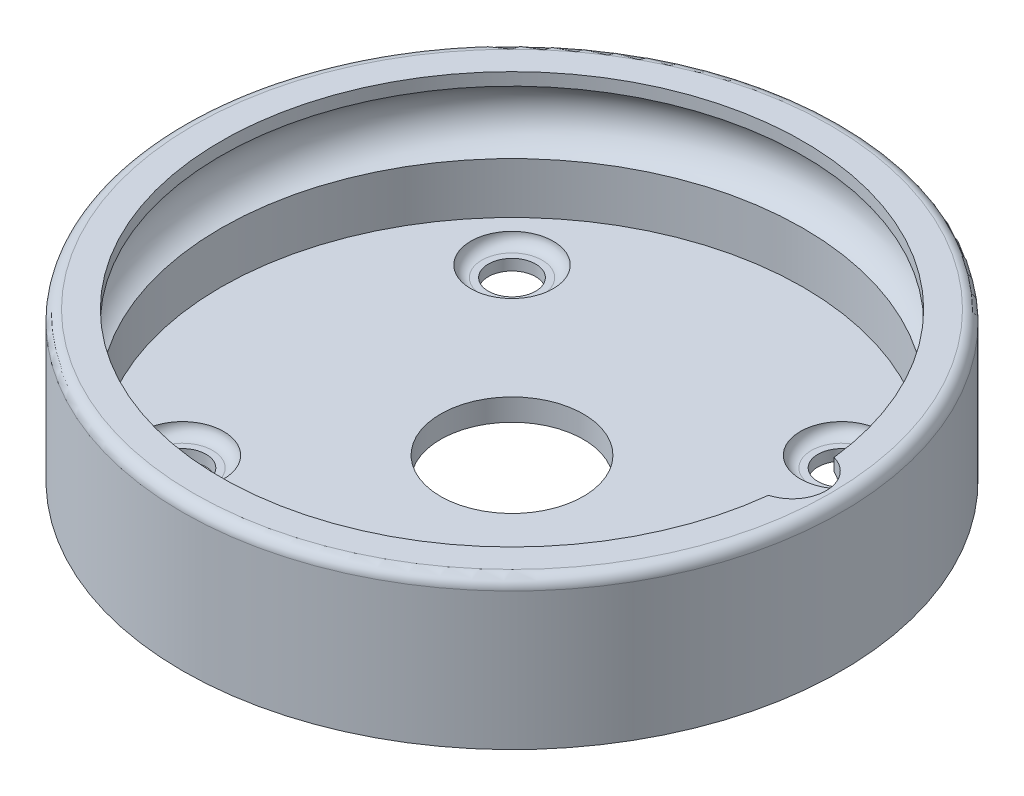
ISO-10303-21;
HEADER;
FILE_DESCRIPTION(('STEP AP214'),'2;1');
FILE_NAME('part.step','',(''),(''),'','','');
FILE_SCHEMA(('AUTOMOTIVE_DESIGN { 1 0 10303 214 1 1 1 1 }'));
ENDSEC;
DATA;
#1=APPLICATION_CONTEXT('core data for automotive mechanical design processes');
#2=APPLICATION_PROTOCOL_DEFINITION('international standard','automotive_design',2000,#1);
#3=PRODUCT_CONTEXT('',#1,'mechanical');
#4=PRODUCT('Part','Part','',(#3));
#5=PRODUCT_RELATED_PRODUCT_CATEGORY('part','',(#4));
#6=PRODUCT_DEFINITION_FORMATION('','',#4);
#7=PRODUCT_DEFINITION_CONTEXT('part definition',#1,'design');
#8=PRODUCT_DEFINITION('design','',#6,#7);
#9=PRODUCT_DEFINITION_SHAPE('','',#8);
#10=(LENGTH_UNIT() NAMED_UNIT(*) SI_UNIT(.MILLI.,.METRE.));
#11=(NAMED_UNIT(*) PLANE_ANGLE_UNIT() SI_UNIT($,.RADIAN.));
#12=(NAMED_UNIT(*) SI_UNIT($,.STERADIAN.) SOLID_ANGLE_UNIT());
#13=UNCERTAINTY_MEASURE_WITH_UNIT(LENGTH_MEASURE(1.E-05),#10,'distance_accuracy_value','');
#14=(GEOMETRIC_REPRESENTATION_CONTEXT(3) GLOBAL_UNCERTAINTY_ASSIGNED_CONTEXT((#13)) GLOBAL_UNIT_ASSIGNED_CONTEXT((#10,
#11,#12)) REPRESENTATION_CONTEXT('',''));
#15=CARTESIAN_POINT('',(0.,0.,0.));
#16=DIRECTION('',(0.,0.,1.));
#17=DIRECTION('',(1.,0.,0.));
#18=AXIS2_PLACEMENT_3D('',#15,#16,#17);
#19=CARTESIAN_POINT('',(14.9999999999998,0.,-15.0000000000002));
#20=DIRECTION('',(0.,1.,0.));
#21=DIRECTION('',(0.,0.,1.));
#22=AXIS2_PLACEMENT_3D('',#19,#20,#21);
#23=CYLINDRICAL_SURFACE('',#22,2.15);
#24=CARTESIAN_POINT('',(14.9999999999998,0.,-15.0000000000002));
#25=DIRECTION('',(0.,1.,0.));
#26=DIRECTION('',(-1.,0.,0.));
#27=AXIS2_PLACEMENT_3D('',#24,#25,#26);
#28=CIRCLE('',#27,2.15);
#29=CARTESIAN_POINT('',(12.8499999999998,0.,-15.0000000000001));
#30=VERTEX_POINT('',#29);
#31=EDGE_CURVE('E179',#30,#30,#28,.T.);
#32=ORIENTED_EDGE('',*,*,#31,.F.);
#33=EDGE_LOOP('',(#32));
#34=FACE_BOUND('',#33,.T.);
#35=CARTESIAN_POINT('',(14.9999999999998,1.,-15.0000000000002));
#36=DIRECTION('',(0.,1.,0.));
#37=DIRECTION('',(0.,0.,1.));
#38=AXIS2_PLACEMENT_3D('',#35,#36,#37);
#39=CIRCLE('',#38,2.15);
#40=CARTESIAN_POINT('',(14.9999999999998,1.,-12.8500000000002));
#41=VERTEX_POINT('',#40);
#42=EDGE_CURVE('E176',#41,#41,#39,.F.);
#43=ORIENTED_EDGE('',*,*,#42,.F.);
#44=EDGE_LOOP('',(#43));
#45=FACE_BOUND('',#44,.T.);
#46=ADVANCED_FACE('F37',(#34,#45),#23,.F.);
#47=CARTESIAN_POINT('',(15.,0.,15.));
#48=DIRECTION('',(0.,1.,0.));
#49=DIRECTION('',(0.,0.,1.));
#50=AXIS2_PLACEMENT_3D('',#47,#48,#49);
#51=CYLINDRICAL_SURFACE('',#50,2.15);
#52=CARTESIAN_POINT('',(15.,0.,15.));
#53=DIRECTION('',(0.,1.,0.));
#54=DIRECTION('',(0.,0.,-1.));
#55=AXIS2_PLACEMENT_3D('',#52,#53,#54);
#56=CIRCLE('',#55,2.15);
#57=CARTESIAN_POINT('',(15.,0.,12.85));
#58=VERTEX_POINT('',#57);
#59=EDGE_CURVE('E272',#58,#58,#56,.T.);
#60=ORIENTED_EDGE('',*,*,#59,.F.);
#61=EDGE_LOOP('',(#60));
#62=FACE_BOUND('',#61,.T.);
#63=CARTESIAN_POINT('',(15.,1.,15.));
#64=DIRECTION('',(0.,1.,0.));
#65=DIRECTION('',(0.,0.,1.));
#66=AXIS2_PLACEMENT_3D('',#63,#64,#65);
#67=CIRCLE('',#66,2.15);
#68=CARTESIAN_POINT('',(15.,1.,17.15));
#69=VERTEX_POINT('',#68);
#70=EDGE_CURVE('E172',#69,#69,#67,.F.);
#71=ORIENTED_EDGE('',*,*,#70,.F.);
#72=EDGE_LOOP('',(#71));
#73=FACE_BOUND('',#72,.T.);
#74=ADVANCED_FACE('F123',(#62,#73),#51,.F.);
#75=CARTESIAN_POINT('',(-14.9999999999999,0.,15.0000000000001));
#76=DIRECTION('',(0.,1.,0.));
#77=DIRECTION('',(0.,0.,1.));
#78=AXIS2_PLACEMENT_3D('',#75,#76,#77);
#79=CYLINDRICAL_SURFACE('',#78,2.15);
#80=CARTESIAN_POINT('',(-14.9999999999999,0.,15.0000000000001));
#81=DIRECTION('',(0.,1.,0.));
#82=DIRECTION('',(1.,0.,0.));
#83=AXIS2_PLACEMENT_3D('',#80,#81,#82);
#84=CIRCLE('',#83,2.15);
#85=CARTESIAN_POINT('',(-12.8499999999999,0.,15.));
#86=VERTEX_POINT('',#85);
#87=EDGE_CURVE('E163',#86,#86,#84,.T.);
#88=ORIENTED_EDGE('',*,*,#87,.F.);
#89=EDGE_LOOP('',(#88));
#90=FACE_BOUND('',#89,.T.);
#91=CARTESIAN_POINT('',(-14.9999999999999,1.,15.0000000000001));
#92=DIRECTION('',(0.,1.,0.));
#93=DIRECTION('',(0.,0.,1.));
#94=AXIS2_PLACEMENT_3D('',#91,#92,#93);
#95=CIRCLE('',#94,2.15);
#96=CARTESIAN_POINT('',(-14.9999999999999,1.,17.1500000000001));
#97=VERTEX_POINT('',#96);
#98=EDGE_CURVE('E169',#97,#97,#95,.F.);
#99=ORIENTED_EDGE('',*,*,#98,.F.);
#100=EDGE_LOOP('',(#99));
#101=FACE_BOUND('',#100,.T.);
#102=ADVANCED_FACE('F129',(#90,#101),#79,.F.);
#103=CARTESIAN_POINT('',(-15.,0.,-15.));
#104=DIRECTION('',(0.,1.,0.));
#105=DIRECTION('',(0.,0.,1.));
#106=AXIS2_PLACEMENT_3D('',#103,#104,#105);
#107=CYLINDRICAL_SURFACE('',#106,2.15);
#108=CARTESIAN_POINT('',(-15.,0.,-15.));
#109=DIRECTION('',(0.,1.,0.));
#110=DIRECTION('',(0.,0.,1.));
#111=AXIS2_PLACEMENT_3D('',#108,#109,#110);
#112=CIRCLE('',#111,2.15);
#113=CARTESIAN_POINT('',(-15.,0.,-12.85));
#114=VERTEX_POINT('',#113);
#115=EDGE_CURVE('E155',#114,#114,#112,.T.);
#116=ORIENTED_EDGE('',*,*,#115,.F.);
#117=EDGE_LOOP('',(#116));
#118=FACE_BOUND('',#117,.T.);
#119=CARTESIAN_POINT('',(-15.,1.,-15.));
#120=DIRECTION('',(0.,1.,0.));
#121=DIRECTION('',(0.,0.,1.));
#122=AXIS2_PLACEMENT_3D('',#119,#120,#121);
#123=CIRCLE('',#122,2.15);
#124=CARTESIAN_POINT('',(-15.,1.,-12.85));
#125=VERTEX_POINT('',#124);
#126=EDGE_CURVE('E158',#125,#125,#123,.F.);
#127=ORIENTED_EDGE('',*,*,#126,.F.);
#128=EDGE_LOOP('',(#127));
#129=FACE_BOUND('',#128,.T.);
#130=ADVANCED_FACE('F140',(#118,#129),#107,.F.);
#131=CARTESIAN_POINT('',(0.,2.,0.));
#132=DIRECTION('',(0.,1.,0.));
#133=DIRECTION('',(0.,0.,1.));
#134=AXIS2_PLACEMENT_3D('',#131,#132,#133);
#135=PLANE('',#134);
#136=CARTESIAN_POINT('',(-14.9999999999999,2.,15.0000000000001));
#137=DIRECTION('',(0.,1.,0.));
#138=DIRECTION('',(1.,0.,0.));
#139=AXIS2_PLACEMENT_3D('',#136,#137,#138);
#140=CIRCLE('',#139,3.75);
#141=CARTESIAN_POINT('',(-11.2499999999999,2.,15.));
#142=VERTEX_POINT('',#141);
#143=EDGE_CURVE('E173',#142,#142,#140,.T.);
#144=ORIENTED_EDGE('',*,*,#143,.F.);
#145=EDGE_LOOP('',(#144));
#146=FACE_BOUND('',#145,.T.);
#147=CARTESIAN_POINT('',(15.,2.,15.));
#148=DIRECTION('',(0.,1.,0.));
#149=DIRECTION('',(0.,0.,-1.));
#150=AXIS2_PLACEMENT_3D('',#147,#148,#149);
#151=CIRCLE('',#150,3.75);
#152=CARTESIAN_POINT('',(15.,2.,11.25));
#153=VERTEX_POINT('',#152);
#154=EDGE_CURVE('E280',#153,#153,#151,.T.);
#155=ORIENTED_EDGE('',*,*,#154,.F.);
#156=EDGE_LOOP('',(#155));
#157=FACE_BOUND('',#156,.T.);
#158=CARTESIAN_POINT('',(14.9999999999998,2.,-15.0000000000002));
#159=DIRECTION('',(0.,1.,0.));
#160=DIRECTION('',(-1.,0.,0.));
#161=AXIS2_PLACEMENT_3D('',#158,#159,#160);
#162=CIRCLE('',#161,3.75);
#163=CARTESIAN_POINT('',(11.2499999999998,2.,-15.0000000000001));
#164=VERTEX_POINT('',#163);
#165=EDGE_CURVE('E277',#164,#164,#162,.T.);
#166=ORIENTED_EDGE('',*,*,#165,.F.);
#167=EDGE_LOOP('',(#166));
#168=FACE_BOUND('',#167,.T.);
#169=CARTESIAN_POINT('',(-15.,2.,-15.));
#170=DIRECTION('',(0.,1.,0.));
#171=DIRECTION('',(0.,0.,1.));
#172=AXIS2_PLACEMENT_3D('',#169,#170,#171);
#173=CIRCLE('',#172,3.75);
#174=CARTESIAN_POINT('',(-15.,2.,-11.25));
#175=VERTEX_POINT('',#174);
#176=EDGE_CURVE('E160',#175,#175,#173,.T.);
#177=ORIENTED_EDGE('',*,*,#176,.F.);
#178=EDGE_LOOP('',(#177));
#179=FACE_BOUND('',#178,.T.);
#180=CARTESIAN_POINT('',(0.,2.,0.));
#181=DIRECTION('',(0.,1.,0.));
#182=DIRECTION('',(0.,0.,1.));
#183=AXIS2_PLACEMENT_3D('',#180,#181,#182);
#184=CIRCLE('',#183,26.5);
#185=CARTESIAN_POINT('',(26.5,2.,0.));
#186=VERTEX_POINT('',#185);
#187=EDGE_CURVE('E238',#186,#186,#184,.T.);
#188=ORIENTED_EDGE('',*,*,#187,.T.);
#189=CARTESIAN_POINT('',(25.5,2.,0.));
#190=DIRECTION('',(0.,1.,0.));
#191=DIRECTION('',(0.,0.,1.));
#192=AXIS2_PLACEMENT_3D('',#189,#190,#191);
#193=CIRCLE('',#192,1.);
#194=EDGE_CURVE('E50',#186,#186,#193,.T.);
#195=ORIENTED_EDGE('',*,*,#194,.F.);
#196=EDGE_LOOP('',(#188,#195));
#197=FACE_BOUND('',#196,.T.);
#198=CARTESIAN_POINT('',(0.,2.,0.));
#199=DIRECTION('',(0.,1.,0.));
#200=DIRECTION('',(0.,0.,1.));
#201=AXIS2_PLACEMENT_3D('',#198,#199,#200);
#202=CIRCLE('',#201,6.5);
#203=CARTESIAN_POINT('',(0.,2.,6.5));
#204=VERTEX_POINT('',#203);
#205=EDGE_CURVE('E78',#204,#204,#202,.T.);
#206=ORIENTED_EDGE('',*,*,#205,.F.);
#207=EDGE_LOOP('',(#206));
#208=FACE_BOUND('',#207,.T.);
#209=ADVANCED_FACE('F142',(#146,#157,#168,#179,#197,#208),#135,.T.);
#210=CARTESIAN_POINT('',(0.,2.,0.));
#211=DIRECTION('',(0.,1.,0.));
#212=DIRECTION('',(0.,0.,1.));
#213=AXIS2_PLACEMENT_3D('',#210,#211,#212);
#214=CYLINDRICAL_SURFACE('',#213,6.5);
#215=CARTESIAN_POINT('',(0.,0.,0.));
#216=DIRECTION('',(0.,1.,0.));
#217=DIRECTION('',(0.,0.,1.));
#218=AXIS2_PLACEMENT_3D('',#215,#216,#217);
#219=CIRCLE('',#218,6.5);
#220=CARTESIAN_POINT('',(0.,0.,6.5));
#221=VERTEX_POINT('',#220);
#222=EDGE_CURVE('E250',#221,#221,#219,.T.);
#223=ORIENTED_EDGE('',*,*,#222,.F.);
#224=EDGE_LOOP('',(#223));
#225=FACE_BOUND('',#224,.T.);
#226=ORIENTED_EDGE('',*,*,#205,.T.);
#227=EDGE_LOOP('',(#226));
#228=FACE_BOUND('',#227,.T.);
#229=ADVANCED_FACE('F148',(#225,#228),#214,.F.);
#230=CARTESIAN_POINT('',(0.,0.,0.));
#231=DIRECTION('',(0.,1.,0.));
#232=DIRECTION('',(0.,0.,1.));
#233=AXIS2_PLACEMENT_3D('',#230,#231,#232);
#234=PLANE('',#233);
#235=CARTESIAN_POINT('',(25.5,0.,0.));
#236=DIRECTION('',(0.,1.,0.));
#237=DIRECTION('',(0.,0.,1.));
#238=AXIS2_PLACEMENT_3D('',#235,#236,#237);
#239=CIRCLE('',#238,1.);
#240=CARTESIAN_POINT('',(25.5,0.,1.));
#241=VERTEX_POINT('',#240);
#242=EDGE_CURVE('E281',#241,#241,#239,.T.);
#243=ORIENTED_EDGE('',*,*,#242,.T.);
#244=EDGE_LOOP('',(#243));
#245=FACE_BOUND('',#244,.T.);
#246=ORIENTED_EDGE('',*,*,#87,.T.);
#247=EDGE_LOOP('',(#246));
#248=FACE_BOUND('',#247,.T.);
#249=ORIENTED_EDGE('',*,*,#59,.T.);
#250=EDGE_LOOP('',(#249));
#251=FACE_BOUND('',#250,.T.);
#252=ORIENTED_EDGE('',*,*,#31,.T.);
#253=EDGE_LOOP('',(#252));
#254=FACE_BOUND('',#253,.T.);
#255=ORIENTED_EDGE('',*,*,#115,.T.);
#256=EDGE_LOOP('',(#255));
#257=FACE_BOUND('',#256,.T.);
#258=CARTESIAN_POINT('',(0.,0.,0.));
#259=DIRECTION('',(0.,1.,0.));
#260=DIRECTION('',(0.,0.,1.));
#261=AXIS2_PLACEMENT_3D('',#258,#259,#260);
#262=CIRCLE('',#261,30.);
#263=CARTESIAN_POINT('',(0.,0.,30.));
#264=VERTEX_POINT('',#263);
#265=EDGE_CURVE('E247',#264,#264,#262,.T.);
#266=ORIENTED_EDGE('',*,*,#265,.F.);
#267=EDGE_LOOP('',(#266));
#268=FACE_BOUND('',#267,.T.);
#269=ORIENTED_EDGE('',*,*,#222,.T.);
#270=EDGE_LOOP('',(#269));
#271=FACE_BOUND('',#270,.T.);
#272=ADVANCED_FACE('F208',(#245,#248,#251,#254,#257,#268,#271),#234,.F.);
#273=CARTESIAN_POINT('',(0.,2.,0.));
#274=DIRECTION('',(0.,1.,0.));
#275=DIRECTION('',(0.,0.,1.));
#276=AXIS2_PLACEMENT_3D('',#273,#274,#275);
#277=CYLINDRICAL_SURFACE('',#276,30.);
#278=CARTESIAN_POINT('',(0.,12.5,0.));
#279=DIRECTION('',(0.,1.,0.));
#280=DIRECTION('',(0.,0.,1.));
#281=AXIS2_PLACEMENT_3D('',#278,#279,#280);
#282=CIRCLE('',#281,30.);
#283=CARTESIAN_POINT('',(0.,12.5,30.));
#284=VERTEX_POINT('',#283);
#285=EDGE_CURVE('E244',#284,#284,#282,.T.);
#286=ORIENTED_EDGE('',*,*,#285,.F.);
#287=EDGE_LOOP('',(#286));
#288=FACE_BOUND('',#287,.T.);
#289=ORIENTED_EDGE('',*,*,#265,.T.);
#290=EDGE_LOOP('',(#289));
#291=FACE_BOUND('',#290,.T.);
#292=ADVANCED_FACE('F212',(#288,#291),#277,.T.);
#293=CARTESIAN_POINT('',(0.,12.5,0.));
#294=DIRECTION('',(0.,1.,0.));
#295=DIRECTION('',(0.,0.,1.));
#296=AXIS2_PLACEMENT_3D('',#293,#294,#295);
#297=TOROIDAL_SURFACE('',#296,29.,1.);
#298=CARTESIAN_POINT('',(0.,13.5,0.));
#299=DIRECTION('',(0.,1.,0.));
#300=DIRECTION('',(0.,0.,1.));
#301=AXIS2_PLACEMENT_3D('',#298,#299,#300);
#302=CIRCLE('',#301,29.);
#303=CARTESIAN_POINT('',(0.,13.5,29.));
#304=VERTEX_POINT('',#303);
#305=EDGE_CURVE('E235',#304,#304,#302,.T.);
#306=ORIENTED_EDGE('',*,*,#305,.F.);
#307=EDGE_LOOP('',(#306));
#308=FACE_BOUND('',#307,.T.);
#309=ORIENTED_EDGE('',*,*,#285,.T.);
#310=EDGE_LOOP('',(#309));
#311=FACE_BOUND('',#310,.T.);
#312=ADVANCED_FACE('F216',(#308,#311),#297,.T.);
#313=CARTESIAN_POINT('',(0.,13.5,0.));
#314=DIRECTION('',(0.,-1.,0.));
#315=DIRECTION('',(0.,0.,-1.));
#316=AXIS2_PLACEMENT_3D('',#313,#314,#315);
#317=PLANE('',#316);
#318=CARTESIAN_POINT('',(0.,13.5,0.));
#319=DIRECTION('',(0.,1.,0.));
#320=DIRECTION('',(0.,0.,1.));
#321=AXIS2_PLACEMENT_3D('',#318,#319,#320);
#322=CIRCLE('',#321,26.5);
#323=CARTESIAN_POINT('',(26.3311764705882,13.5,-2.9864938765617));
#324=VERTEX_POINT('',#323);
#325=CARTESIAN_POINT('',(26.3311764705882,13.5,2.9864938765617));
#326=VERTEX_POINT('',#325);
#327=EDGE_CURVE('E232',#324,#326,#322,.T.);
#328=ORIENTED_EDGE('',*,*,#327,.F.);
#329=CARTESIAN_POINT('',(25.5,13.5,0.));
#330=DIRECTION('',(0.,1.,0.));
#331=DIRECTION('',(0.,0.,1.));
#332=AXIS2_PLACEMENT_3D('',#329,#330,#331);
#333=CIRCLE('',#332,3.1);
#334=EDGE_CURVE('E85',#326,#324,#333,.T.);
#335=ORIENTED_EDGE('',*,*,#334,.F.);
#336=EDGE_LOOP('',(#328,#335));
#337=FACE_BOUND('',#336,.T.);
#338=ORIENTED_EDGE('',*,*,#305,.T.);
#339=EDGE_LOOP('',(#338));
#340=FACE_BOUND('',#339,.T.);
#341=ADVANCED_FACE('F220',(#337,#340),#317,.F.);
#342=CARTESIAN_POINT('',(0.,2.,0.));
#343=DIRECTION('',(0.,1.,0.));
#344=DIRECTION('',(0.,0.,1.));
#345=AXIS2_PLACEMENT_3D('',#342,#343,#344);
#346=CYLINDRICAL_SURFACE('',#345,26.5);
#347=CARTESIAN_POINT('',(0.,12.3549299466011,0.));
#348=DIRECTION('',(0.,1.,0.));
#349=DIRECTION('',(0.,0.,1.));
#350=AXIS2_PLACEMENT_3D('',#347,#348,#349);
#351=CIRCLE('',#350,26.5);
#352=CARTESIAN_POINT('',(26.3311764705882,12.3549299466011,-2.98649387656169));
#353=VERTEX_POINT('',#352);
#354=CARTESIAN_POINT('',(26.3311764705882,12.3549299466011,2.98649387656169));
#355=VERTEX_POINT('',#354);
#356=EDGE_CURVE('E91',#353,#355,#351,.T.);
#357=ORIENTED_EDGE('',*,*,#356,.F.);
#358=DIRECTION('',(0.,1.,0.));
#359=VECTOR('',#358,1.);
#360=CARTESIAN_POINT('',(26.3311764705882,11.5,-2.9864938765617));
#361=LINE('',#360,#359);
#362=EDGE_CURVE('E230',#353,#324,#361,.T.);
#363=ORIENTED_EDGE('',*,*,#362,.T.);
#364=ORIENTED_EDGE('',*,*,#327,.T.);
#365=DIRECTION('',(0.,1.,0.));
#366=VECTOR('',#365,1.);
#367=CARTESIAN_POINT('',(26.3311764705882,11.5,2.9864938765617));
#368=LINE('',#367,#366);
#369=EDGE_CURVE('E84',#326,#355,#368,.F.);
#370=ORIENTED_EDGE('',*,*,#369,.T.);
#371=EDGE_LOOP('',(#357,#363,#364,#370));
#372=FACE_BOUND('',#371,.T.);
#373=ADVANCED_FACE('F119',(#372),#346,.F.);
#374=CARTESIAN_POINT('',(0.,9.5,0.));
#375=DIRECTION('',(0.,1.,0.));
#376=DIRECTION('',(0.,0.,1.));
#377=AXIS2_PLACEMENT_3D('',#374,#375,#376);
#378=TOROIDAL_SURFACE('',#377,25.5,3.025);
#379=CARTESIAN_POINT('',(26.3305829090901,12.3551299466011,-2.98665900817744));
#380=CARTESIAN_POINT('',(26.4129934383973,12.3273706800348,-2.96374561204357));
#381=CARTESIAN_POINT('',(26.4934396339511,12.2966893418499,-2.93769509150399));
#382=CARTESIAN_POINT('',(26.6499262814898,12.2302156340682,-2.88003493059753));
#383=CARTESIAN_POINT('',(26.7259749180971,12.1944332190318,-2.84843609037646));
#384=CARTESIAN_POINT('',(26.9457196793102,12.0811534823227,-2.74695250466182));
#385=CARTESIAN_POINT('',(27.0827629019969,11.9971096917603,-2.66986906171934));
#386=CARTESIAN_POINT('',(27.3688353501295,11.7938686150579,-2.48065241754704));
#387=CARTESIAN_POINT('',(27.5126503502446,11.6710953605847,-2.36455538031247));
#388=CARTESIAN_POINT('',(27.7067337584933,11.4759103395307,-2.17908403754312));
#389=CARTESIAN_POINT('',(27.7679776590908,11.4087856743493,-2.11515659997116));
#390=CARTESIAN_POINT('',(27.8832667331335,11.2712925226675,-1.98434649304493));
#391=CARTESIAN_POINT('',(27.9373130281027,11.2009245438426,-1.91746428626788));
#392=CARTESIAN_POINT('',(28.0393583960158,11.0557752790568,-1.78020317015653));
#393=CARTESIAN_POINT('',(28.0872116041281,10.9809332441751,-1.70978076089637));
#394=CARTESIAN_POINT('',(28.1757147886816,10.8281720095533,-1.56765814397347));
#395=CARTESIAN_POINT('',(28.2163608795745,10.7502511774653,-1.49595726984184));
#396=CARTESIAN_POINT('',(28.2903733363425,10.5912900580926,-1.35288079481149));
#397=CARTESIAN_POINT('',(28.3237638622484,10.5102612146129,-1.28150491405978));
#398=CARTESIAN_POINT('',(28.3834011843081,10.3438593057761,-1.14094576676593));
#399=CARTESIAN_POINT('',(28.4096572445209,10.2584920465617,-1.07175976088443));
#400=CARTESIAN_POINT('',(28.4449902882723,10.1189209579039,-0.968819531672358));
#401=CARTESIAN_POINT('',(28.4565930971753,10.0671514089122,-0.932650729473222));
#402=CARTESIAN_POINT('',(28.4771776237911,9.96020843043099,-0.864670901661443));
#403=CARTESIAN_POINT('',(28.4861603767749,9.90503635585995,-0.832858157469422));
#404=CARTESIAN_POINT('',(28.4987084603544,9.80797770164198,-0.786220954921835));
#405=CARTESIAN_POINT('',(28.5030898579178,9.76728684606916,-0.769188935090664));
#406=CARTESIAN_POINT('',(28.5100659834148,9.68373618435733,-0.74142576591409));
#407=CARTESIAN_POINT('',(28.5126698926049,9.64088877051299,-0.730662280766799));
#408=CARTESIAN_POINT('',(28.5148194123851,9.58128183396308,-0.721712758571903));
#409=CARTESIAN_POINT('',(28.5152583901194,9.56507661460579,-0.719874378721848));
#410=CARTESIAN_POINT('',(28.5158463212606,9.53251724042803,-0.717406371874195));
#411=CARTESIAN_POINT('',(28.5159943367808,9.51616277414028,-0.716780653858322));
#412=CARTESIAN_POINT('',(28.5159926396629,9.4998,-0.716790344172543));
#413=B_SPLINE_CURVE_WITH_KNOTS('',3,(#379,#380,#381,#382,#383,#384,#385,#386,#387,#388,#389,
#390,#391,#392,#393,#394,#395,#396,#397,#398,#399,#400,#401,#402,#403,#404,#405,#406,#407,#408,
#409,#410,#411,#412),.UNSPECIFIED.,.F.,.F.,(4,2,2,2,2,2,2,2,2,2,2,2,2,2,2,2,4),(0.,
0.269504091103956,0.538489276987445,1.07078335332712,1.73276116464867,2.06582226636075,
2.39883140994434,2.73863432729446,3.07861988807032,3.41745537947801,3.75584876948397,
3.94833232412874,4.14073971879149,4.27338887381116,4.40534756392126,4.45425021919628,
4.50331025033395),.UNSPECIFIED.);
#414=CARTESIAN_POINT('',(28.5159926470588,9.5,-0.716790313053354));
#415=VERTEX_POINT('',#414);
#416=EDGE_CURVE('E83',#353,#415,#413,.T.);
#417=ORIENTED_EDGE('',*,*,#416,.F.);
#418=ORIENTED_EDGE('',*,*,#356,.T.);
#419=CARTESIAN_POINT('',(28.5159926396629,9.4998,0.716790344172554));
#420=CARTESIAN_POINT('',(28.5160250963365,9.54491712198481,0.716548209428541));
#421=CARTESIAN_POINT('',(28.5148732292316,9.58958541325846,0.721518941159394));
#422=CARTESIAN_POINT('',(28.5105758390886,9.67626005891502,0.73928973372746));
#423=CARTESIAN_POINT('',(28.5074756067468,9.71830364560903,0.751911707567136));
#424=CARTESIAN_POINT('',(28.4971054506647,9.82633684441462,0.792455922789986));
#425=CARTESIAN_POINT('',(28.4884362167494,9.89034308261128,0.824997762048844));
#426=CARTESIAN_POINT('',(28.4675062109602,10.0143154777551,0.897428119024715));
#427=CARTESIAN_POINT('',(28.4551950935745,10.0742094356587,0.937416495933339));
#428=CARTESIAN_POINT('',(28.4297594849414,10.1807935754177,1.01382990543428));
#429=CARTESIAN_POINT('',(28.4171275612743,10.2279996045238,1.04970804593394));
#430=CARTESIAN_POINT('',(28.3897629122174,10.3207051501623,1.1228533576449));
#431=CARTESIAN_POINT('',(28.3750294040487,10.3662040228173,1.16012104258349));
#432=CARTESIAN_POINT('',(28.3277016727726,10.5008415241472,1.27308855119697));
#433=CARTESIAN_POINT('',(28.2920092376998,10.5880028173575,1.349862688863));
#434=CARTESIAN_POINT('',(28.2124673097731,10.7583809701963,1.5033351457552));
#435=CARTESIAN_POINT('',(28.1686255989883,10.841601498673,1.58003346771469));
#436=CARTESIAN_POINT('',(28.0726821830841,11.0045146454315,1.73186821177801));
#437=CARTESIAN_POINT('',(28.0205864171265,11.0842097480696,1.8070057133237));
#438=CARTESIAN_POINT('',(27.9052466920406,11.243772081154,1.95812206052628));
#439=CARTESIAN_POINT('',(27.841590513091,11.3234674107839,2.03397111566739));
#440=CARTESIAN_POINT('',(27.7048241339946,11.4784695077391,2.18149017478573));
#441=CARTESIAN_POINT('',(27.6317100634517,11.553774460013,2.25315845036957));
#442=CARTESIAN_POINT('',(27.3986322699076,11.7712008116755,2.45924946105526));
#443=CARTESIAN_POINT('',(27.2240892563519,11.9060301598697,2.5859091373177));
#444=CARTESIAN_POINT('',(26.925167868113,12.0909870253863,2.75565824835678));
#445=CARTESIAN_POINT('',(26.8139732938094,12.1517848018891,2.81058708159185));
#446=CARTESIAN_POINT('',(26.5803938839706,12.2624311709968,2.90841689912316));
#447=CARTESIAN_POINT('',(26.4579427198564,12.312208079455,2.9512396116523));
#448=CARTESIAN_POINT('',(26.3305829090901,12.3551299466011,2.98665900817744));
#449=B_SPLINE_CURVE_WITH_KNOTS('',3,(#419,#420,#421,#422,#423,#424,#425,#426,#427,#428,#429,
#430,#431,#432,#433,#434,#435,#436,#437,#438,#439,#440,#441,#442,#443,#444,#445,#446,#447,#448),
.UNSPECIFIED.,.F.,.F.,(4,2,2,2,2,2,2,2,2,2,2,2,2,2,4),(0.,0.134356581824802,0.265699973565666,
0.481487526086554,0.700409872229464,0.882181036168884,1.06402008221754,1.42815101215508,
1.79193598885614,2.15546038492754,2.53626519558593,2.91722633663358,3.67363737107443,
4.08676046041995,4.50249649356663),.UNSPECIFIED.);
#450=CARTESIAN_POINT('',(28.5159926470588,9.5,0.716790313053354));
#451=VERTEX_POINT('',#450);
#452=EDGE_CURVE('E77',#451,#355,#449,.T.);
#453=ORIENTED_EDGE('',*,*,#452,.F.);
#454=CARTESIAN_POINT('',(0.,9.5,0.));
#455=DIRECTION('',(0.,1.,0.));
#456=DIRECTION('',(0.,0.,1.));
#457=AXIS2_PLACEMENT_3D('',#454,#455,#456);
#458=CIRCLE('',#457,28.525);
#459=EDGE_CURVE('E72',#451,#415,#458,.T.);
#460=ORIENTED_EDGE('',*,*,#459,.T.);
#461=EDGE_LOOP('',(#417,#418,#453,#460));
#462=FACE_BOUND('',#461,.T.);
#463=CARTESIAN_POINT('',(0.,6.64507005339886,0.));
#464=DIRECTION('',(0.,1.,0.));
#465=DIRECTION('',(0.,0.,1.));
#466=AXIS2_PLACEMENT_3D('',#463,#464,#465);
#467=CIRCLE('',#466,26.5);
#468=CARTESIAN_POINT('',(0.,6.64507005339886,26.5));
#469=VERTEX_POINT('',#468);
#470=EDGE_CURVE('E233',#469,#469,#467,.T.);
#471=ORIENTED_EDGE('',*,*,#470,.F.);
#472=EDGE_LOOP('',(#471));
#473=FACE_BOUND('',#472,.T.);
#474=ADVANCED_FACE('F88',(#462,#473),#378,.F.);
#475=CARTESIAN_POINT('',(0.,2.,0.));
#476=DIRECTION('',(0.,1.,0.));
#477=DIRECTION('',(0.,0.,1.));
#478=AXIS2_PLACEMENT_3D('',#475,#476,#477);
#479=CYLINDRICAL_SURFACE('',#478,26.5);
#480=ORIENTED_EDGE('',*,*,#187,.F.);
#481=EDGE_LOOP('',(#480));
#482=FACE_BOUND('',#481,.T.);
#483=ORIENTED_EDGE('',*,*,#470,.T.);
#484=EDGE_LOOP('',(#483));
#485=FACE_BOUND('',#484,.T.);
#486=ADVANCED_FACE('F111',(#482,#485),#479,.F.);
#487=CARTESIAN_POINT('',(25.5,9.5,0.));
#488=DIRECTION('',(0.,1.,0.));
#489=DIRECTION('',(0.,0.,1.));
#490=AXIS2_PLACEMENT_3D('',#487,#488,#489);
#491=CYLINDRICAL_SURFACE('',#490,3.1);
#492=ORIENTED_EDGE('',*,*,#416,.T.);
#493=CARTESIAN_POINT('',(25.5,9.5,0.));
#494=DIRECTION('',(0.,1.,0.));
#495=DIRECTION('',(0.,0.,1.));
#496=AXIS2_PLACEMENT_3D('',#493,#494,#495);
#497=CIRCLE('',#496,3.1);
#498=EDGE_CURVE('E56',#451,#415,#497,.T.);
#499=ORIENTED_EDGE('',*,*,#498,.F.);
#500=ORIENTED_EDGE('',*,*,#452,.T.);
#501=ORIENTED_EDGE('',*,*,#369,.F.);
#502=ORIENTED_EDGE('',*,*,#334,.T.);
#503=ORIENTED_EDGE('',*,*,#362,.F.);
#504=EDGE_LOOP('',(#492,#499,#500,#501,#502,#503));
#505=FACE_BOUND('',#504,.T.);
#506=ADVANCED_FACE('F81',(#505),#491,.F.);
#507=CARTESIAN_POINT('',(25.5,9.5,0.));
#508=DIRECTION('',(0.,1.,0.));
#509=DIRECTION('',(0.,0.,1.));
#510=AXIS2_PLACEMENT_3D('',#507,#508,#509);
#511=PLANE('',#510);
#512=ORIENTED_EDGE('',*,*,#498,.T.);
#513=ORIENTED_EDGE('',*,*,#459,.F.);
#514=EDGE_LOOP('',(#512,#513));
#515=FACE_BOUND('',#514,.T.);
#516=ADVANCED_FACE('F73',(#515),#511,.T.);
#517=CARTESIAN_POINT('',(-15.,1.,-15.));
#518=DIRECTION('',(0.,1.,0.));
#519=DIRECTION('',(0.,0.,1.));
#520=AXIS2_PLACEMENT_3D('',#517,#518,#519);
#521=PLANE('',#520);
#522=CARTESIAN_POINT('',(-15.,1.,-15.));
#523=DIRECTION('',(0.,1.,0.));
#524=DIRECTION('',(0.,0.,1.));
#525=AXIS2_PLACEMENT_3D('',#522,#523,#524);
#526=CIRCLE('',#525,2.75);
#527=CARTESIAN_POINT('',(-15.,1.,-12.25));
#528=VERTEX_POINT('',#527);
#529=EDGE_CURVE('E93',#528,#528,#526,.T.);
#530=ORIENTED_EDGE('',*,*,#529,.T.);
#531=EDGE_LOOP('',(#530));
#532=FACE_BOUND('',#531,.T.);
#533=ORIENTED_EDGE('',*,*,#126,.T.);
#534=EDGE_LOOP('',(#533));
#535=FACE_BOUND('',#534,.T.);
#536=ADVANCED_FACE('F136',(#532,#535),#521,.T.);
#537=CARTESIAN_POINT('',(-15.,2.,-15.));
#538=DIRECTION('',(0.,1.,0.));
#539=DIRECTION('',(0.,0.,1.));
#540=AXIS2_PLACEMENT_3D('',#537,#538,#539);
#541=TOROIDAL_SURFACE('',#540,2.75,1.);
#542=ORIENTED_EDGE('',*,*,#176,.T.);
#543=EDGE_LOOP('',(#542));
#544=FACE_BOUND('',#543,.T.);
#545=ORIENTED_EDGE('',*,*,#529,.F.);
#546=EDGE_LOOP('',(#545));
#547=FACE_BOUND('',#546,.T.);
#548=ADVANCED_FACE('F138',(#544,#547),#541,.F.);
#549=CARTESIAN_POINT('',(-14.9999999999999,1.,15.0000000000001));
#550=DIRECTION('',(0.,1.,0.));
#551=DIRECTION('',(1.,0.,0.));
#552=AXIS2_PLACEMENT_3D('',#549,#550,#551);
#553=PLANE('',#552);
#554=CARTESIAN_POINT('',(-14.9999999999999,1.,15.0000000000001));
#555=DIRECTION('',(0.,1.,0.));
#556=DIRECTION('',(0.,0.,1.));
#557=AXIS2_PLACEMENT_3D('',#554,#555,#556);
#558=CIRCLE('',#557,2.75);
#559=CARTESIAN_POINT('',(-14.9999999999999,1.,17.7500000000001));
#560=VERTEX_POINT('',#559);
#561=EDGE_CURVE('E168',#560,#560,#558,.T.);
#562=ORIENTED_EDGE('',*,*,#561,.T.);
#563=EDGE_LOOP('',(#562));
#564=FACE_BOUND('',#563,.T.);
#565=ORIENTED_EDGE('',*,*,#98,.T.);
#566=EDGE_LOOP('',(#565));
#567=FACE_BOUND('',#566,.T.);
#568=ADVANCED_FACE('F203',(#564,#567),#553,.T.);
#569=CARTESIAN_POINT('',(15.,1.,15.));
#570=DIRECTION('',(0.,1.,0.));
#571=DIRECTION('',(0.,0.,-1.));
#572=AXIS2_PLACEMENT_3D('',#569,#570,#571);
#573=PLANE('',#572);
#574=CARTESIAN_POINT('',(15.,1.,15.));
#575=DIRECTION('',(0.,1.,0.));
#576=DIRECTION('',(0.,0.,1.));
#577=AXIS2_PLACEMENT_3D('',#574,#575,#576);
#578=CIRCLE('',#577,2.75);
#579=CARTESIAN_POINT('',(15.,1.,17.75));
#580=VERTEX_POINT('',#579);
#581=EDGE_CURVE('E45',#580,#580,#578,.T.);
#582=ORIENTED_EDGE('',*,*,#581,.T.);
#583=EDGE_LOOP('',(#582));
#584=FACE_BOUND('',#583,.T.);
#585=ORIENTED_EDGE('',*,*,#70,.T.);
#586=EDGE_LOOP('',(#585));
#587=FACE_BOUND('',#586,.T.);
#588=ADVANCED_FACE('F184',(#584,#587),#573,.T.);
#589=CARTESIAN_POINT('',(14.9999999999998,1.,-15.0000000000002));
#590=DIRECTION('',(0.,1.,0.));
#591=DIRECTION('',(-1.,0.,0.));
#592=AXIS2_PLACEMENT_3D('',#589,#590,#591);
#593=PLANE('',#592);
#594=CARTESIAN_POINT('',(14.9999999999998,1.,-15.0000000000002));
#595=DIRECTION('',(0.,1.,0.));
#596=DIRECTION('',(0.,0.,1.));
#597=AXIS2_PLACEMENT_3D('',#594,#595,#596);
#598=CIRCLE('',#597,2.75);
#599=CARTESIAN_POINT('',(14.9999999999998,1.,-12.2500000000002));
#600=VERTEX_POINT('',#599);
#601=EDGE_CURVE('E11',#600,#600,#598,.T.);
#602=ORIENTED_EDGE('',*,*,#601,.T.);
#603=EDGE_LOOP('',(#602));
#604=FACE_BOUND('',#603,.T.);
#605=ORIENTED_EDGE('',*,*,#42,.T.);
#606=EDGE_LOOP('',(#605));
#607=FACE_BOUND('',#606,.T.);
#608=ADVANCED_FACE('F197',(#604,#607),#593,.T.);
#609=CARTESIAN_POINT('',(-14.9999999999999,2.,15.0000000000001));
#610=DIRECTION('',(0.,1.,0.));
#611=DIRECTION('',(0.,0.,1.));
#612=AXIS2_PLACEMENT_3D('',#609,#610,#611);
#613=TOROIDAL_SURFACE('',#612,2.75,1.);
#614=ORIENTED_EDGE('',*,*,#143,.T.);
#615=EDGE_LOOP('',(#614));
#616=FACE_BOUND('',#615,.T.);
#617=ORIENTED_EDGE('',*,*,#561,.F.);
#618=EDGE_LOOP('',(#617));
#619=FACE_BOUND('',#618,.T.);
#620=ADVANCED_FACE('F189',(#616,#619),#613,.F.);
#621=CARTESIAN_POINT('',(15.,2.,15.));
#622=DIRECTION('',(0.,1.,0.));
#623=DIRECTION('',(0.,0.,1.));
#624=AXIS2_PLACEMENT_3D('',#621,#622,#623);
#625=TOROIDAL_SURFACE('',#624,2.75,1.);
#626=ORIENTED_EDGE('',*,*,#154,.T.);
#627=EDGE_LOOP('',(#626));
#628=FACE_BOUND('',#627,.T.);
#629=ORIENTED_EDGE('',*,*,#581,.F.);
#630=EDGE_LOOP('',(#629));
#631=FACE_BOUND('',#630,.T.);
#632=ADVANCED_FACE('F187',(#628,#631),#625,.F.);
#633=CARTESIAN_POINT('',(14.9999999999998,2.,-15.0000000000002));
#634=DIRECTION('',(0.,1.,0.));
#635=DIRECTION('',(0.,0.,1.));
#636=AXIS2_PLACEMENT_3D('',#633,#634,#635);
#637=TOROIDAL_SURFACE('',#636,2.75,1.);
#638=ORIENTED_EDGE('',*,*,#165,.T.);
#639=EDGE_LOOP('',(#638));
#640=FACE_BOUND('',#639,.T.);
#641=ORIENTED_EDGE('',*,*,#601,.F.);
#642=EDGE_LOOP('',(#641));
#643=FACE_BOUND('',#642,.T.);
#644=ADVANCED_FACE('F39',(#640,#643),#637,.F.);
#645=CARTESIAN_POINT('',(25.5,0.,0.));
#646=DIRECTION('',(0.,1.,0.));
#647=DIRECTION('',(0.,0.,1.));
#648=AXIS2_PLACEMENT_3D('',#645,#646,#647);
#649=CYLINDRICAL_SURFACE('',#648,1.);
#650=ORIENTED_EDGE('',*,*,#242,.F.);
#651=EDGE_LOOP('',(#650));
#652=FACE_BOUND('',#651,.T.);
#653=ORIENTED_EDGE('',*,*,#194,.T.);
#654=EDGE_LOOP('',(#653));
#655=FACE_BOUND('',#654,.T.);
#656=ADVANCED_FACE('F195',(#652,#655),#649,.F.);
#657=CLOSED_SHELL('',(#46,#74,#102,#130,#209,#229,#272,#292,#312,#341,#373,#474,#486,#506,#516,
#536,#548,#568,#588,#608,#620,#632,#644,#656));
#658=MANIFOLD_SOLID_BREP('B2',#657);
#659=ADVANCED_BREP_SHAPE_REPRESENTATION('',(#18,#658),#14);
#660=SHAPE_DEFINITION_REPRESENTATION(#9,#659);
ENDSEC;
END-ISO-10303-21;
